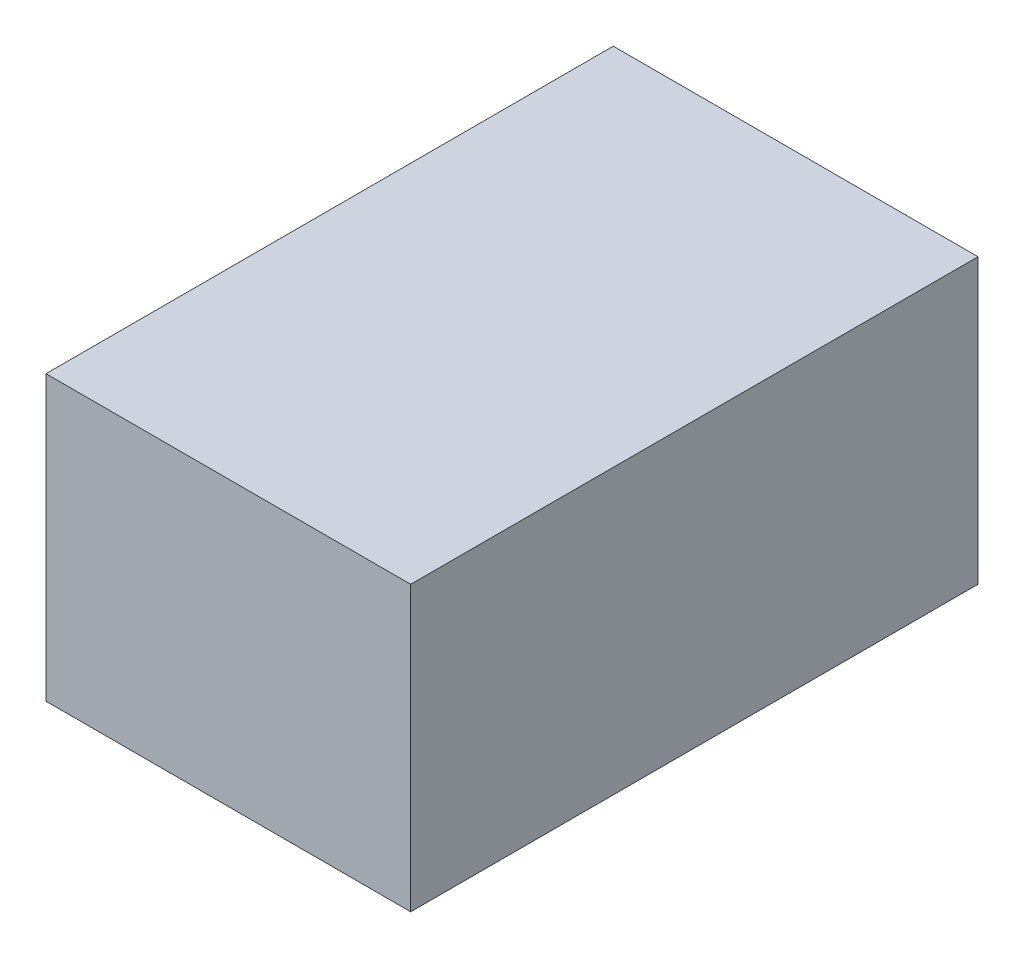
ISO-10303-21;
HEADER;
FILE_DESCRIPTION(('STEP AP214'),'2;1');
FILE_NAME('part.step','',(''),(''),'','','');
FILE_SCHEMA(('AUTOMOTIVE_DESIGN { 1 0 10303 214 1 1 1 1 }'));
ENDSEC;
DATA;
#1=APPLICATION_CONTEXT('core data for automotive mechanical design processes');
#2=APPLICATION_PROTOCOL_DEFINITION('international standard','automotive_design',2000,#1);
#3=PRODUCT_CONTEXT('',#1,'mechanical');
#4=PRODUCT('Part','Part','',(#3));
#5=PRODUCT_RELATED_PRODUCT_CATEGORY('part','',(#4));
#6=PRODUCT_DEFINITION_FORMATION('','',#4);
#7=PRODUCT_DEFINITION_CONTEXT('part definition',#1,'design');
#8=PRODUCT_DEFINITION('design','',#6,#7);
#9=PRODUCT_DEFINITION_SHAPE('','',#8);
#10=(LENGTH_UNIT() NAMED_UNIT(*) SI_UNIT(.MILLI.,.METRE.));
#11=(NAMED_UNIT(*) PLANE_ANGLE_UNIT() SI_UNIT($,.RADIAN.));
#12=(NAMED_UNIT(*) SI_UNIT($,.STERADIAN.) SOLID_ANGLE_UNIT());
#13=UNCERTAINTY_MEASURE_WITH_UNIT(LENGTH_MEASURE(1.E-05),#10,'distance_accuracy_value','');
#14=(GEOMETRIC_REPRESENTATION_CONTEXT(3) GLOBAL_UNCERTAINTY_ASSIGNED_CONTEXT((#13)) GLOBAL_UNIT_ASSIGNED_CONTEXT((#10,
#11,#12)) REPRESENTATION_CONTEXT('',''));
#15=CARTESIAN_POINT('',(0.,0.,0.));
#16=DIRECTION('',(0.,0.,1.));
#17=DIRECTION('',(1.,0.,0.));
#18=AXIS2_PLACEMENT_3D('',#15,#16,#17);
#19=CARTESIAN_POINT('',(45.,70.,70.));
#20=DIRECTION('',(-1.,0.,0.));
#21=DIRECTION('',(0.,0.,1.));
#22=AXIS2_PLACEMENT_3D('',#19,#20,#21);
#23=PLANE('',#22);
#24=DIRECTION('',(0.,0.,-1.));
#25=VECTOR('',#24,1.);
#26=CARTESIAN_POINT('',(45.,0.,70.));
#27=LINE('',#26,#25);
#28=CARTESIAN_POINT('',(45.,0.,70.));
#29=VERTEX_POINT('',#28);
#30=CARTESIAN_POINT('',(45.,0.,-70.));
#31=VERTEX_POINT('',#30);
#32=EDGE_CURVE('E102',#29,#31,#27,.T.);
#33=ORIENTED_EDGE('',*,*,#32,.T.);
#34=DIRECTION('',(0.,-1.,0.));
#35=VECTOR('',#34,1.);
#36=CARTESIAN_POINT('',(45.,70.,-70.));
#37=LINE('',#36,#35);
#38=CARTESIAN_POINT('',(45.,70.,-70.));
#39=VERTEX_POINT('',#38);
#40=EDGE_CURVE('E11',#39,#31,#37,.T.);
#41=ORIENTED_EDGE('',*,*,#40,.F.);
#42=DIRECTION('',(0.,0.,-1.));
#43=VECTOR('',#42,1.);
#44=CARTESIAN_POINT('',(45.,70.,70.));
#45=LINE('',#44,#43);
#46=CARTESIAN_POINT('',(45.,70.,70.));
#47=VERTEX_POINT('',#46);
#48=EDGE_CURVE('E90',#47,#39,#45,.T.);
#49=ORIENTED_EDGE('',*,*,#48,.F.);
#50=DIRECTION('',(0.,-1.,0.));
#51=VECTOR('',#50,1.);
#52=CARTESIAN_POINT('',(45.,70.,70.));
#53=LINE('',#52,#51);
#54=EDGE_CURVE('E98',#47,#29,#53,.T.);
#55=ORIENTED_EDGE('',*,*,#54,.T.);
#56=EDGE_LOOP('',(#33,#41,#49,#55));
#57=FACE_BOUND('',#56,.T.);
#58=ADVANCED_FACE('F39',(#57),#23,.F.);
#59=CARTESIAN_POINT('',(-45.,70.,-70.));
#60=DIRECTION('',(0.,0.,1.));
#61=DIRECTION('',(1.,0.,0.));
#62=AXIS2_PLACEMENT_3D('',#59,#60,#61);
#63=PLANE('',#62);
#64=DIRECTION('',(-1.,0.,0.));
#65=VECTOR('',#64,1.);
#66=CARTESIAN_POINT('',(-45.,0.,-70.));
#67=LINE('',#66,#65);
#68=CARTESIAN_POINT('',(-45.,0.,-70.));
#69=VERTEX_POINT('',#68);
#70=EDGE_CURVE('E94',#31,#69,#67,.T.);
#71=ORIENTED_EDGE('',*,*,#70,.T.);
#72=DIRECTION('',(0.,-1.,0.));
#73=VECTOR('',#72,1.);
#74=CARTESIAN_POINT('',(-45.,70.,-70.));
#75=LINE('',#74,#73);
#76=CARTESIAN_POINT('',(-45.,70.,-70.));
#77=VERTEX_POINT('',#76);
#78=EDGE_CURVE('E47',#77,#69,#75,.T.);
#79=ORIENTED_EDGE('',*,*,#78,.F.);
#80=DIRECTION('',(-1.,0.,0.));
#81=VECTOR('',#80,1.);
#82=CARTESIAN_POINT('',(-45.,70.,-70.));
#83=LINE('',#82,#81);
#84=EDGE_CURVE('E85',#39,#77,#83,.T.);
#85=ORIENTED_EDGE('',*,*,#84,.F.);
#86=ORIENTED_EDGE('',*,*,#40,.T.);
#87=EDGE_LOOP('',(#71,#79,#85,#86));
#88=FACE_BOUND('',#87,.T.);
#89=ADVANCED_FACE('F93',(#88),#63,.F.);
#90=CARTESIAN_POINT('',(-45.,70.,70.));
#91=DIRECTION('',(1.,0.,0.));
#92=DIRECTION('',(0.,0.,-1.));
#93=AXIS2_PLACEMENT_3D('',#90,#91,#92);
#94=PLANE('',#93);
#95=DIRECTION('',(0.,0.,1.));
#96=VECTOR('',#95,1.);
#97=CARTESIAN_POINT('',(-45.,0.,70.));
#98=LINE('',#97,#96);
#99=CARTESIAN_POINT('',(-45.,0.,70.));
#100=VERTEX_POINT('',#99);
#101=EDGE_CURVE('E72',#69,#100,#98,.T.);
#102=ORIENTED_EDGE('',*,*,#101,.T.);
#103=DIRECTION('',(0.,-1.,0.));
#104=VECTOR('',#103,1.);
#105=CARTESIAN_POINT('',(-45.,70.,70.));
#106=LINE('',#105,#104);
#107=CARTESIAN_POINT('',(-45.,70.,70.));
#108=VERTEX_POINT('',#107);
#109=EDGE_CURVE('E95',#108,#100,#106,.T.);
#110=ORIENTED_EDGE('',*,*,#109,.F.);
#111=DIRECTION('',(0.,0.,1.));
#112=VECTOR('',#111,1.);
#113=CARTESIAN_POINT('',(-45.,70.,70.));
#114=LINE('',#113,#112);
#115=EDGE_CURVE('E88',#77,#108,#114,.T.);
#116=ORIENTED_EDGE('',*,*,#115,.F.);
#117=ORIENTED_EDGE('',*,*,#78,.T.);
#118=EDGE_LOOP('',(#102,#110,#116,#117));
#119=FACE_BOUND('',#118,.T.);
#120=ADVANCED_FACE('F96',(#119),#94,.F.);
#121=CARTESIAN_POINT('',(-45.,70.,70.));
#122=DIRECTION('',(0.,0.,-1.));
#123=DIRECTION('',(-1.,0.,0.));
#124=AXIS2_PLACEMENT_3D('',#121,#122,#123);
#125=PLANE('',#124);
#126=DIRECTION('',(1.,0.,0.));
#127=VECTOR('',#126,1.);
#128=CARTESIAN_POINT('',(-45.,0.,70.));
#129=LINE('',#128,#127);
#130=EDGE_CURVE('E78',#100,#29,#129,.T.);
#131=ORIENTED_EDGE('',*,*,#130,.T.);
#132=ORIENTED_EDGE('',*,*,#54,.F.);
#133=DIRECTION('',(1.,0.,0.));
#134=VECTOR('',#133,1.);
#135=CARTESIAN_POINT('',(-45.,70.,70.));
#136=LINE('',#135,#134);
#137=EDGE_CURVE('E55',#108,#47,#136,.T.);
#138=ORIENTED_EDGE('',*,*,#137,.F.);
#139=ORIENTED_EDGE('',*,*,#109,.T.);
#140=EDGE_LOOP('',(#131,#132,#138,#139));
#141=FACE_BOUND('',#140,.T.);
#142=ADVANCED_FACE('F109',(#141),#125,.F.);
#143=CARTESIAN_POINT('',(0.,70.,0.));
#144=DIRECTION('',(0.,-1.,0.));
#145=DIRECTION('',(0.,0.,-1.));
#146=AXIS2_PLACEMENT_3D('',#143,#144,#145);
#147=PLANE('',#146);
#148=ORIENTED_EDGE('',*,*,#48,.T.);
#149=ORIENTED_EDGE('',*,*,#84,.T.);
#150=ORIENTED_EDGE('',*,*,#115,.T.);
#151=ORIENTED_EDGE('',*,*,#137,.T.);
#152=EDGE_LOOP('',(#148,#149,#150,#151));
#153=FACE_BOUND('',#152,.T.);
#154=ADVANCED_FACE('F86',(#153),#147,.F.);
#155=CARTESIAN_POINT('',(0.,0.,0.));
#156=DIRECTION('',(0.,-1.,0.));
#157=DIRECTION('',(0.,0.,-1.));
#158=AXIS2_PLACEMENT_3D('',#155,#156,#157);
#159=PLANE('',#158);
#160=ORIENTED_EDGE('',*,*,#32,.F.);
#161=ORIENTED_EDGE('',*,*,#130,.F.);
#162=ORIENTED_EDGE('',*,*,#101,.F.);
#163=ORIENTED_EDGE('',*,*,#70,.F.);
#164=EDGE_LOOP('',(#160,#161,#162,#163));
#165=FACE_BOUND('',#164,.T.);
#166=ADVANCED_FACE('F112',(#165),#159,.T.);
#167=CLOSED_SHELL('',(#58,#89,#120,#142,#154,#166));
#168=MANIFOLD_SOLID_BREP('B2',#167);
#169=ADVANCED_BREP_SHAPE_REPRESENTATION('',(#18,#168),#14);
#170=SHAPE_DEFINITION_REPRESENTATION(#9,#169);
ENDSEC;
END-ISO-10303-21;
